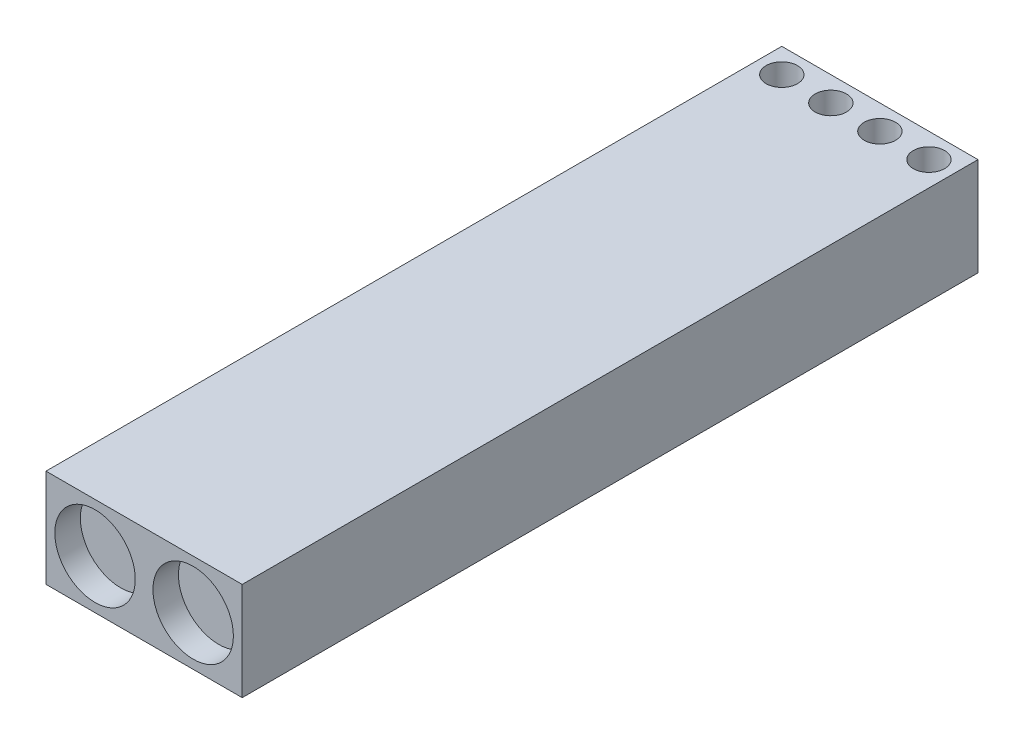
ISO-10303-21;
HEADER;
FILE_DESCRIPTION(('STEP AP214'),'2;1');
FILE_NAME('part.step','',(''),(''),'','','');
FILE_SCHEMA(('AUTOMOTIVE_DESIGN { 1 0 10303 214 1 1 1 1 }'));
ENDSEC;
DATA;
#1=APPLICATION_CONTEXT('core data for automotive mechanical design processes');
#2=APPLICATION_PROTOCOL_DEFINITION('international standard','automotive_design',2000,#1);
#3=PRODUCT_CONTEXT('',#1,'mechanical');
#4=PRODUCT('Part','Part','',(#3));
#5=PRODUCT_RELATED_PRODUCT_CATEGORY('part','',(#4));
#6=PRODUCT_DEFINITION_FORMATION('','',#4);
#7=PRODUCT_DEFINITION_CONTEXT('part definition',#1,'design');
#8=PRODUCT_DEFINITION('design','',#6,#7);
#9=PRODUCT_DEFINITION_SHAPE('','',#8);
#10=(LENGTH_UNIT() NAMED_UNIT(*) SI_UNIT(.MILLI.,.METRE.));
#11=(NAMED_UNIT(*) PLANE_ANGLE_UNIT() SI_UNIT($,.RADIAN.));
#12=(NAMED_UNIT(*) SI_UNIT($,.STERADIAN.) SOLID_ANGLE_UNIT());
#13=UNCERTAINTY_MEASURE_WITH_UNIT(LENGTH_MEASURE(1.E-05),#10,'distance_accuracy_value','');
#14=(GEOMETRIC_REPRESENTATION_CONTEXT(3) GLOBAL_UNCERTAINTY_ASSIGNED_CONTEXT((#13)) GLOBAL_UNIT_ASSIGNED_CONTEXT((#10,
#11,#12)) REPRESENTATION_CONTEXT('',''));
#15=CARTESIAN_POINT('',(0.,0.,0.));
#16=DIRECTION('',(0.,0.,1.));
#17=DIRECTION('',(1.,0.,0.));
#18=AXIS2_PLACEMENT_3D('',#15,#16,#17);
#19=CARTESIAN_POINT('',(10.,10.,150.));
#20=DIRECTION('',(-1.,0.,0.));
#21=DIRECTION('',(0.,0.,1.));
#22=AXIS2_PLACEMENT_3D('',#19,#20,#21);
#23=PLANE('',#22);
#24=DIRECTION('',(0.,1.,0.));
#25=VECTOR('',#24,1.);
#26=CARTESIAN_POINT('',(10.,10.,0.));
#27=LINE('',#26,#25);
#28=CARTESIAN_POINT('',(10.,-10.,0.));
#29=VERTEX_POINT('',#28);
#30=CARTESIAN_POINT('',(10.,10.,0.));
#31=VERTEX_POINT('',#30);
#32=EDGE_CURVE('E87',#29,#31,#27,.T.);
#33=ORIENTED_EDGE('',*,*,#32,.T.);
#34=DIRECTION('',(0.,0.,-1.));
#35=VECTOR('',#34,1.);
#36=CARTESIAN_POINT('',(10.,10.,150.));
#37=LINE('',#36,#35);
#38=CARTESIAN_POINT('',(10.,10.,150.));
#39=VERTEX_POINT('',#38);
#40=EDGE_CURVE('E11',#39,#31,#37,.T.);
#41=ORIENTED_EDGE('',*,*,#40,.F.);
#42=DIRECTION('',(0.,1.,0.));
#43=VECTOR('',#42,1.);
#44=CARTESIAN_POINT('',(10.,10.,150.));
#45=LINE('',#44,#43);
#46=CARTESIAN_POINT('',(10.,-10.,150.));
#47=VERTEX_POINT('',#46);
#48=EDGE_CURVE('E126',#47,#39,#45,.T.);
#49=ORIENTED_EDGE('',*,*,#48,.F.);
#50=DIRECTION('',(0.,0.,-1.));
#51=VECTOR('',#50,1.);
#52=CARTESIAN_POINT('',(10.,-10.,150.));
#53=LINE('',#52,#51);
#54=EDGE_CURVE('E47',#47,#29,#53,.T.);
#55=ORIENTED_EDGE('',*,*,#54,.T.);
#56=EDGE_LOOP('',(#33,#41,#49,#55));
#57=FACE_BOUND('',#56,.T.);
#58=ADVANCED_FACE('F39',(#57),#23,.F.);
#59=CARTESIAN_POINT('',(-10.,10.,150.));
#60=DIRECTION('',(0.,-1.,0.));
#61=DIRECTION('',(0.,0.,-1.));
#62=AXIS2_PLACEMENT_3D('',#59,#60,#61);
#63=PLANE('',#62);
#64=CARTESIAN_POINT('',(-25.,9.99999999999999,5.));
#65=DIRECTION('',(0.,-1.,0.));
#66=DIRECTION('',(0.,0.,1.));
#67=AXIS2_PLACEMENT_3D('',#64,#65,#66);
#68=CIRCLE('',#67,3.2);
#69=CARTESIAN_POINT('',(-25.,9.99999999999999,8.20000000000001));
#70=VERTEX_POINT('',#69);
#71=EDGE_CURVE('E162',#70,#70,#68,.T.);
#72=ORIENTED_EDGE('',*,*,#71,.T.);
#73=EDGE_LOOP('',(#72));
#74=FACE_BOUND('',#73,.T.);
#75=CARTESIAN_POINT('',(-15.,9.99999999999999,5.));
#76=DIRECTION('',(0.,1.,0.));
#77=DIRECTION('',(0.,0.,1.));
#78=AXIS2_PLACEMENT_3D('',#75,#76,#77);
#79=CIRCLE('',#78,3.2);
#80=CARTESIAN_POINT('',(-15.,9.99999999999999,8.20000000000001));
#81=VERTEX_POINT('',#80);
#82=EDGE_CURVE('E166',#81,#81,#79,.T.);
#83=ORIENTED_EDGE('',*,*,#82,.F.);
#84=EDGE_LOOP('',(#83));
#85=FACE_BOUND('',#84,.T.);
#86=CARTESIAN_POINT('',(-5.,10.,5.));
#87=DIRECTION('',(0.,-1.,0.));
#88=DIRECTION('',(0.,0.,1.));
#89=AXIS2_PLACEMENT_3D('',#86,#87,#88);
#90=CIRCLE('',#89,3.2);
#91=CARTESIAN_POINT('',(-5.,10.,8.20000000000001));
#92=VERTEX_POINT('',#91);
#93=EDGE_CURVE('E108',#92,#92,#90,.T.);
#94=ORIENTED_EDGE('',*,*,#93,.T.);
#95=EDGE_LOOP('',(#94));
#96=FACE_BOUND('',#95,.T.);
#97=CARTESIAN_POINT('',(5.,10.,5.));
#98=DIRECTION('',(0.,1.,0.));
#99=DIRECTION('',(0.,0.,1.));
#100=AXIS2_PLACEMENT_3D('',#97,#98,#99);
#101=CIRCLE('',#100,3.2);
#102=CARTESIAN_POINT('',(5.,10.,8.20000000000001));
#103=VERTEX_POINT('',#102);
#104=EDGE_CURVE('E112',#103,#103,#101,.T.);
#105=ORIENTED_EDGE('',*,*,#104,.F.);
#106=EDGE_LOOP('',(#105));
#107=FACE_BOUND('',#106,.T.);
#108=DIRECTION('',(-1.,0.,0.));
#109=VECTOR('',#108,1.);
#110=CARTESIAN_POINT('',(-10.,10.,0.));
#111=LINE('',#110,#109);
#112=CARTESIAN_POINT('',(-30.,9.99999999999999,0.));
#113=VERTEX_POINT('',#112);
#114=EDGE_CURVE('E67',#31,#113,#111,.T.);
#115=ORIENTED_EDGE('',*,*,#114,.T.);
#116=DIRECTION('',(0.,0.,-1.));
#117=VECTOR('',#116,1.);
#118=CARTESIAN_POINT('',(-30.,9.99999999999999,150.));
#119=LINE('',#118,#117);
#120=CARTESIAN_POINT('',(-30.,9.99999999999999,150.));
#121=VERTEX_POINT('',#120);
#122=EDGE_CURVE('E82',#121,#113,#119,.T.);
#123=ORIENTED_EDGE('',*,*,#122,.F.);
#124=DIRECTION('',(-1.,0.,0.));
#125=VECTOR('',#124,1.);
#126=CARTESIAN_POINT('',(-10.,10.,150.));
#127=LINE('',#126,#125);
#128=EDGE_CURVE('E72',#39,#121,#127,.T.);
#129=ORIENTED_EDGE('',*,*,#128,.F.);
#130=ORIENTED_EDGE('',*,*,#40,.T.);
#131=EDGE_LOOP('',(#115,#123,#129,#130));
#132=FACE_BOUND('',#131,.T.);
#133=ADVANCED_FACE('F81',(#74,#85,#96,#107,#132),#63,.F.);
#134=CARTESIAN_POINT('',(-10.,-10.,150.));
#135=DIRECTION('',(0.,1.,0.));
#136=DIRECTION('',(0.,0.,1.));
#137=AXIS2_PLACEMENT_3D('',#134,#135,#136);
#138=PLANE('',#137);
#139=DIRECTION('',(1.,0.,0.));
#140=VECTOR('',#139,1.);
#141=CARTESIAN_POINT('',(-10.,-10.,0.));
#142=LINE('',#141,#140);
#143=CARTESIAN_POINT('',(-30.,-10.,0.));
#144=VERTEX_POINT('',#143);
#145=EDGE_CURVE('E86',#144,#29,#142,.T.);
#146=ORIENTED_EDGE('',*,*,#145,.T.);
#147=ORIENTED_EDGE('',*,*,#54,.F.);
#148=DIRECTION('',(1.,0.,0.));
#149=VECTOR('',#148,1.);
#150=CARTESIAN_POINT('',(-10.,-10.,150.));
#151=LINE('',#150,#149);
#152=CARTESIAN_POINT('',(-30.,-10.,150.));
#153=VERTEX_POINT('',#152);
#154=EDGE_CURVE('E55',#153,#47,#151,.T.);
#155=ORIENTED_EDGE('',*,*,#154,.F.);
#156=DIRECTION('',(0.,0.,-1.));
#157=VECTOR('',#156,1.);
#158=CARTESIAN_POINT('',(-30.,-10.,150.));
#159=LINE('',#158,#157);
#160=EDGE_CURVE('E95',#153,#144,#159,.T.);
#161=ORIENTED_EDGE('',*,*,#160,.T.);
#162=EDGE_LOOP('',(#146,#147,#155,#161));
#163=FACE_BOUND('',#162,.T.);
#164=ADVANCED_FACE('F135',(#163),#138,.F.);
#165=CARTESIAN_POINT('',(0.,0.,150.));
#166=DIRECTION('',(0.,0.,1.));
#167=DIRECTION('',(1.,0.,0.));
#168=AXIS2_PLACEMENT_3D('',#165,#166,#167);
#169=PLANE('',#168);
#170=CARTESIAN_POINT('',(-20.,0.,150.));
#171=DIRECTION('',(0.,0.,-1.));
#172=DIRECTION('',(-1.,0.,0.));
#173=AXIS2_PLACEMENT_3D('',#170,#171,#172);
#174=CIRCLE('',#173,8.2);
#175=CARTESIAN_POINT('',(-28.2,0.,150.));
#176=VERTEX_POINT('',#175);
#177=EDGE_CURVE('E103',#176,#176,#174,.T.);
#178=ORIENTED_EDGE('',*,*,#177,.T.);
#179=EDGE_LOOP('',(#178));
#180=FACE_BOUND('',#179,.T.);
#181=CARTESIAN_POINT('',(0.,0.,150.));
#182=DIRECTION('',(0.,0.,1.));
#183=DIRECTION('',(1.,0.,0.));
#184=AXIS2_PLACEMENT_3D('',#181,#182,#183);
#185=CIRCLE('',#184,8.2);
#186=CARTESIAN_POINT('',(8.2,0.,150.));
#187=VERTEX_POINT('',#186);
#188=EDGE_CURVE('E118',#187,#187,#185,.T.);
#189=ORIENTED_EDGE('',*,*,#188,.F.);
#190=EDGE_LOOP('',(#189));
#191=FACE_BOUND('',#190,.T.);
#192=ORIENTED_EDGE('',*,*,#48,.T.);
#193=ORIENTED_EDGE('',*,*,#128,.T.);
#194=DIRECTION('',(0.,1.,0.));
#195=VECTOR('',#194,1.);
#196=CARTESIAN_POINT('',(-30.,9.99999999999999,150.));
#197=LINE('',#196,#195);
#198=EDGE_CURVE('E94',#153,#121,#197,.T.);
#199=ORIENTED_EDGE('',*,*,#198,.F.);
#200=ORIENTED_EDGE('',*,*,#154,.T.);
#201=EDGE_LOOP('',(#192,#193,#199,#200));
#202=FACE_BOUND('',#201,.T.);
#203=ADVANCED_FACE('F136',(#180,#191,#202),#169,.T.);
#204=CARTESIAN_POINT('',(0.,0.,0.));
#205=DIRECTION('',(0.,0.,1.));
#206=DIRECTION('',(1.,0.,0.));
#207=AXIS2_PLACEMENT_3D('',#204,#205,#206);
#208=PLANE('',#207);
#209=ORIENTED_EDGE('',*,*,#32,.F.);
#210=ORIENTED_EDGE('',*,*,#145,.F.);
#211=DIRECTION('',(0.,1.,0.));
#212=VECTOR('',#211,1.);
#213=CARTESIAN_POINT('',(-30.,9.99999999999999,0.));
#214=LINE('',#213,#212);
#215=EDGE_CURVE('E93',#144,#113,#214,.T.);
#216=ORIENTED_EDGE('',*,*,#215,.T.);
#217=ORIENTED_EDGE('',*,*,#114,.F.);
#218=EDGE_LOOP('',(#209,#210,#216,#217));
#219=FACE_BOUND('',#218,.T.);
#220=ADVANCED_FACE('F97',(#219),#208,.F.);
#221=CARTESIAN_POINT('',(0.,0.,144.8));
#222=DIRECTION('',(0.,0.,1.));
#223=DIRECTION('',(1.,0.,0.));
#224=AXIS2_PLACEMENT_3D('',#221,#222,#223);
#225=CYLINDRICAL_SURFACE('',#224,8.2);
#226=CARTESIAN_POINT('',(0.,0.,144.8));
#227=DIRECTION('',(0.,0.,1.));
#228=DIRECTION('',(1.,0.,0.));
#229=AXIS2_PLACEMENT_3D('',#226,#227,#228);
#230=CIRCLE('',#229,8.2);
#231=CARTESIAN_POINT('',(8.2,0.,144.8));
#232=VERTEX_POINT('',#231);
#233=EDGE_CURVE('E121',#232,#232,#230,.T.);
#234=ORIENTED_EDGE('',*,*,#233,.F.);
#235=EDGE_LOOP('',(#234));
#236=FACE_BOUND('',#235,.T.);
#237=ORIENTED_EDGE('',*,*,#188,.T.);
#238=EDGE_LOOP('',(#237));
#239=FACE_BOUND('',#238,.T.);
#240=ADVANCED_FACE('F144',(#236,#239),#225,.F.);
#241=CARTESIAN_POINT('',(0.,0.,144.8));
#242=DIRECTION('',(0.,0.,1.));
#243=DIRECTION('',(1.,0.,0.));
#244=AXIS2_PLACEMENT_3D('',#241,#242,#243);
#245=PLANE('',#244);
#246=ORIENTED_EDGE('',*,*,#233,.T.);
#247=EDGE_LOOP('',(#246));
#248=FACE_BOUND('',#247,.T.);
#249=ADVANCED_FACE('F174',(#248),#245,.T.);
#250=CARTESIAN_POINT('',(5.,-8.,5.));
#251=DIRECTION('',(0.,1.,0.));
#252=DIRECTION('',(0.,0.,1.));
#253=AXIS2_PLACEMENT_3D('',#250,#251,#252);
#254=CYLINDRICAL_SURFACE('',#253,3.2);
#255=CARTESIAN_POINT('',(5.,-8.,5.));
#256=DIRECTION('',(0.,1.,0.));
#257=DIRECTION('',(0.,0.,1.));
#258=AXIS2_PLACEMENT_3D('',#255,#256,#257);
#259=CIRCLE('',#258,3.2);
#260=CARTESIAN_POINT('',(5.,-8.,8.20000000000001));
#261=VERTEX_POINT('',#260);
#262=EDGE_CURVE('E115',#261,#261,#259,.T.);
#263=ORIENTED_EDGE('',*,*,#262,.F.);
#264=EDGE_LOOP('',(#263));
#265=FACE_BOUND('',#264,.T.);
#266=ORIENTED_EDGE('',*,*,#104,.T.);
#267=EDGE_LOOP('',(#266));
#268=FACE_BOUND('',#267,.T.);
#269=ADVANCED_FACE('F171',(#265,#268),#254,.F.);
#270=CARTESIAN_POINT('',(5.,-8.,5.));
#271=DIRECTION('',(0.,1.,0.));
#272=DIRECTION('',(0.,0.,1.));
#273=AXIS2_PLACEMENT_3D('',#270,#271,#272);
#274=PLANE('',#273);
#275=ORIENTED_EDGE('',*,*,#262,.T.);
#276=EDGE_LOOP('',(#275));
#277=FACE_BOUND('',#276,.T.);
#278=ADVANCED_FACE('F173',(#277),#274,.T.);
#279=CARTESIAN_POINT('',(-5.,-8.,5.));
#280=DIRECTION('',(0.,1.,0.));
#281=DIRECTION('',(0.,0.,1.));
#282=AXIS2_PLACEMENT_3D('',#279,#280,#281);
#283=CYLINDRICAL_SURFACE('',#282,3.2);
#284=CARTESIAN_POINT('',(-5.,-8.,5.));
#285=DIRECTION('',(0.,-1.,0.));
#286=DIRECTION('',(0.,0.,1.));
#287=AXIS2_PLACEMENT_3D('',#284,#285,#286);
#288=CIRCLE('',#287,3.2);
#289=CARTESIAN_POINT('',(-5.,-8.,8.20000000000001));
#290=VERTEX_POINT('',#289);
#291=EDGE_CURVE('E109',#290,#290,#288,.T.);
#292=ORIENTED_EDGE('',*,*,#291,.T.);
#293=EDGE_LOOP('',(#292));
#294=FACE_BOUND('',#293,.T.);
#295=ORIENTED_EDGE('',*,*,#93,.F.);
#296=EDGE_LOOP('',(#295));
#297=FACE_BOUND('',#296,.T.);
#298=ADVANCED_FACE('F181',(#294,#297),#283,.F.);
#299=CARTESIAN_POINT('',(-5.,-8.,5.));
#300=DIRECTION('',(0.,1.,0.));
#301=DIRECTION('',(0.,0.,1.));
#302=AXIS2_PLACEMENT_3D('',#299,#300,#301);
#303=PLANE('',#302);
#304=ORIENTED_EDGE('',*,*,#291,.F.);
#305=EDGE_LOOP('',(#304));
#306=FACE_BOUND('',#305,.T.);
#307=ADVANCED_FACE('F220',(#306),#303,.T.);
#308=CARTESIAN_POINT('',(-30.,9.99999999999999,150.));
#309=DIRECTION('',(-1.,0.,0.));
#310=DIRECTION('',(0.,-1.,0.));
#311=AXIS2_PLACEMENT_3D('',#308,#309,#310);
#312=PLANE('',#311);
#313=ORIENTED_EDGE('',*,*,#215,.F.);
#314=ORIENTED_EDGE('',*,*,#160,.F.);
#315=ORIENTED_EDGE('',*,*,#198,.T.);
#316=ORIENTED_EDGE('',*,*,#122,.T.);
#317=EDGE_LOOP('',(#313,#314,#315,#316));
#318=FACE_BOUND('',#317,.T.);
#319=ADVANCED_FACE('F91',(#318),#312,.T.);
#320=CARTESIAN_POINT('',(-20.,0.,144.8));
#321=DIRECTION('',(0.,0.,1.));
#322=DIRECTION('',(1.,0.,0.));
#323=AXIS2_PLACEMENT_3D('',#320,#321,#322);
#324=CYLINDRICAL_SURFACE('',#323,8.2);
#325=CARTESIAN_POINT('',(-20.,0.,144.8));
#326=DIRECTION('',(0.,0.,-1.));
#327=DIRECTION('',(-1.,0.,0.));
#328=AXIS2_PLACEMENT_3D('',#325,#326,#327);
#329=CIRCLE('',#328,8.2);
#330=CARTESIAN_POINT('',(-28.2,0.,144.8));
#331=VERTEX_POINT('',#330);
#332=EDGE_CURVE('E99',#331,#331,#329,.T.);
#333=ORIENTED_EDGE('',*,*,#332,.T.);
#334=EDGE_LOOP('',(#333));
#335=FACE_BOUND('',#334,.T.);
#336=ORIENTED_EDGE('',*,*,#177,.F.);
#337=EDGE_LOOP('',(#336));
#338=FACE_BOUND('',#337,.T.);
#339=ADVANCED_FACE('F264',(#335,#338),#324,.F.);
#340=CARTESIAN_POINT('',(-20.,0.,144.8));
#341=DIRECTION('',(0.,0.,1.));
#342=DIRECTION('',(-1.,0.,0.));
#343=AXIS2_PLACEMENT_3D('',#340,#341,#342);
#344=PLANE('',#343);
#345=ORIENTED_EDGE('',*,*,#332,.F.);
#346=EDGE_LOOP('',(#345));
#347=FACE_BOUND('',#346,.T.);
#348=ADVANCED_FACE('F273',(#347),#344,.T.);
#349=CARTESIAN_POINT('',(-15.,-8.,5.));
#350=DIRECTION('',(0.,1.,0.));
#351=DIRECTION('',(-1.,0.,0.));
#352=AXIS2_PLACEMENT_3D('',#349,#350,#351);
#353=CYLINDRICAL_SURFACE('',#352,3.2);
#354=CARTESIAN_POINT('',(-15.,-8.,5.));
#355=DIRECTION('',(0.,1.,0.));
#356=DIRECTION('',(0.,0.,1.));
#357=AXIS2_PLACEMENT_3D('',#354,#355,#356);
#358=CIRCLE('',#357,3.2);
#359=CARTESIAN_POINT('',(-15.,-8.,8.20000000000001));
#360=VERTEX_POINT('',#359);
#361=EDGE_CURVE('E330',#360,#360,#358,.T.);
#362=ORIENTED_EDGE('',*,*,#361,.F.);
#363=EDGE_LOOP('',(#362));
#364=FACE_BOUND('',#363,.T.);
#365=ORIENTED_EDGE('',*,*,#82,.T.);
#366=EDGE_LOOP('',(#365));
#367=FACE_BOUND('',#366,.T.);
#368=ADVANCED_FACE('F283',(#364,#367),#353,.F.);
#369=CARTESIAN_POINT('',(-15.,-8.,5.));
#370=DIRECTION('',(0.,1.,0.));
#371=DIRECTION('',(0.,0.,1.));
#372=AXIS2_PLACEMENT_3D('',#369,#370,#371);
#373=PLANE('',#372);
#374=ORIENTED_EDGE('',*,*,#361,.T.);
#375=EDGE_LOOP('',(#374));
#376=FACE_BOUND('',#375,.T.);
#377=ADVANCED_FACE('F293',(#376),#373,.T.);
#378=CARTESIAN_POINT('',(-25.,-8.00000000000001,5.));
#379=DIRECTION('',(0.,1.,0.));
#380=DIRECTION('',(-1.,0.,0.));
#381=AXIS2_PLACEMENT_3D('',#378,#379,#380);
#382=CYLINDRICAL_SURFACE('',#381,3.2);
#383=CARTESIAN_POINT('',(-25.,-8.00000000000001,5.));
#384=DIRECTION('',(0.,-1.,0.));
#385=DIRECTION('',(0.,0.,1.));
#386=AXIS2_PLACEMENT_3D('',#383,#384,#385);
#387=CIRCLE('',#386,3.2);
#388=CARTESIAN_POINT('',(-25.,-8.00000000000001,8.20000000000001));
#389=VERTEX_POINT('',#388);
#390=EDGE_CURVE('E328',#389,#389,#387,.T.);
#391=ORIENTED_EDGE('',*,*,#390,.T.);
#392=EDGE_LOOP('',(#391));
#393=FACE_BOUND('',#392,.T.);
#394=ORIENTED_EDGE('',*,*,#71,.F.);
#395=EDGE_LOOP('',(#394));
#396=FACE_BOUND('',#395,.T.);
#397=ADVANCED_FACE('F303',(#393,#396),#382,.F.);
#398=CARTESIAN_POINT('',(-25.,-8.00000000000001,5.));
#399=DIRECTION('',(0.,1.,0.));
#400=DIRECTION('',(0.,0.,1.));
#401=AXIS2_PLACEMENT_3D('',#398,#399,#400);
#402=PLANE('',#401);
#403=ORIENTED_EDGE('',*,*,#390,.F.);
#404=EDGE_LOOP('',(#403));
#405=FACE_BOUND('',#404,.T.);
#406=ADVANCED_FACE('F313',(#405),#402,.T.);
#407=CLOSED_SHELL('',(#58,#133,#164,#203,#220,#240,#249,#269,#278,#298,#307,#319,#339,#348,#368,
#377,#397,#406));
#408=MANIFOLD_SOLID_BREP('B2',#407);
#409=ADVANCED_BREP_SHAPE_REPRESENTATION('',(#18,#408),#14);
#410=SHAPE_DEFINITION_REPRESENTATION(#9,#409);
ENDSEC;
END-ISO-10303-21;
